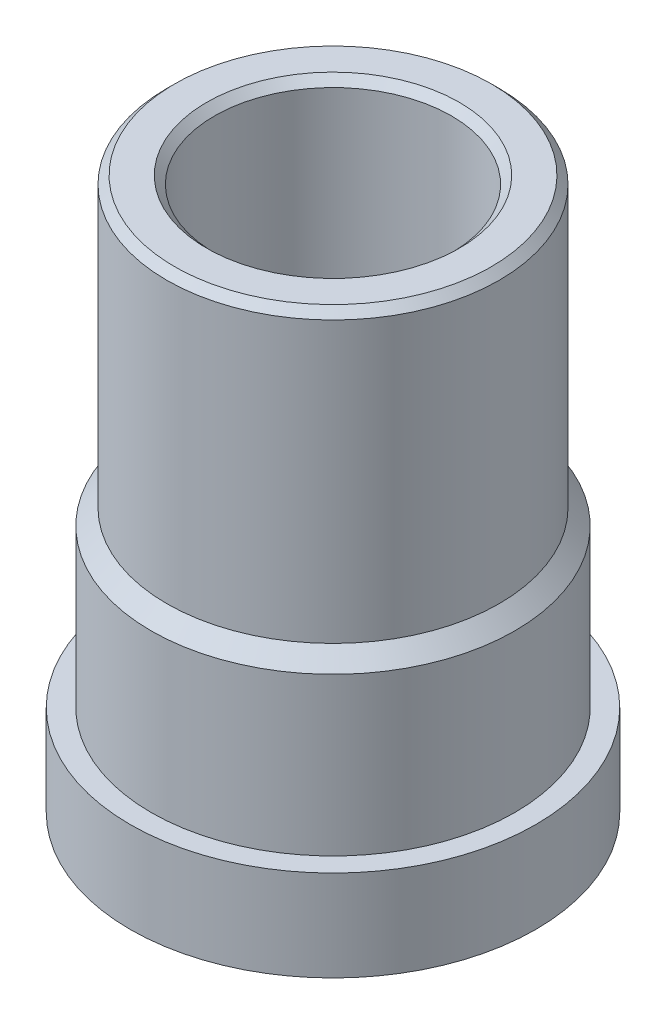
ISO-10303-21;
HEADER;
FILE_DESCRIPTION(('STEP AP214'),'2;1');
FILE_NAME('part.step','',(''),(''),'','','');
FILE_SCHEMA(('AUTOMOTIVE_DESIGN { 1 0 10303 214 1 1 1 1 }'));
ENDSEC;
DATA;
#1=APPLICATION_CONTEXT('core data for automotive mechanical design processes');
#2=APPLICATION_PROTOCOL_DEFINITION('international standard','automotive_design',2000,#1);
#3=PRODUCT_CONTEXT('',#1,'mechanical');
#4=PRODUCT('Part','Part','',(#3));
#5=PRODUCT_RELATED_PRODUCT_CATEGORY('part','',(#4));
#6=PRODUCT_DEFINITION_FORMATION('','',#4);
#7=PRODUCT_DEFINITION_CONTEXT('part definition',#1,'design');
#8=PRODUCT_DEFINITION('design','',#6,#7);
#9=PRODUCT_DEFINITION_SHAPE('','',#8);
#10=(LENGTH_UNIT() NAMED_UNIT(*) SI_UNIT(.MILLI.,.METRE.));
#11=(NAMED_UNIT(*) PLANE_ANGLE_UNIT() SI_UNIT($,.RADIAN.));
#12=(NAMED_UNIT(*) SI_UNIT($,.STERADIAN.) SOLID_ANGLE_UNIT());
#13=UNCERTAINTY_MEASURE_WITH_UNIT(LENGTH_MEASURE(1.E-05),#10,'distance_accuracy_value','');
#14=(GEOMETRIC_REPRESENTATION_CONTEXT(3) GLOBAL_UNCERTAINTY_ASSIGNED_CONTEXT((#13)) GLOBAL_UNIT_ASSIGNED_CONTEXT((#10,
#11,#12)) REPRESENTATION_CONTEXT('',''));
#15=CARTESIAN_POINT('',(0.,0.,0.));
#16=DIRECTION('',(0.,0.,1.));
#17=DIRECTION('',(1.,0.,0.));
#18=AXIS2_PLACEMENT_3D('',#15,#16,#17);
#19=CARTESIAN_POINT('',(0.,0.,0.));
#20=DIRECTION('',(0.,-1.,0.));
#21=DIRECTION('',(0.,0.,-1.));
#22=AXIS2_PLACEMENT_3D('',#19,#20,#21);
#23=PLANE('',#22);
#24=CARTESIAN_POINT('',(0.,0.,0.));
#25=DIRECTION('',(0.,-1.,0.));
#26=DIRECTION('',(0.,0.,-1.));
#27=AXIS2_PLACEMENT_3D('',#24,#25,#26);
#28=CIRCLE('',#27,0.915);
#29=CARTESIAN_POINT('',(0.,0.,-0.915));
#30=VERTEX_POINT('',#29);
#31=EDGE_CURVE('E10',#30,#30,#28,.T.);
#32=ORIENTED_EDGE('',*,*,#31,.T.);
#33=EDGE_LOOP('',(#32));
#34=FACE_BOUND('',#33,.T.);
#35=ADVANCED_FACE('F32',(#34),#23,.T.);
#36=CARTESIAN_POINT('',(0.,0.,0.));
#37=DIRECTION('',(0.,-1.,0.));
#38=DIRECTION('',(0.,0.,-1.));
#39=AXIS2_PLACEMENT_3D('',#36,#37,#38);
#40=CYLINDRICAL_SURFACE('',#39,0.915);
#41=CARTESIAN_POINT('',(0.,0.41,0.));
#42=DIRECTION('',(0.,-1.,0.));
#43=DIRECTION('',(0.,0.,-1.));
#44=AXIS2_PLACEMENT_3D('',#41,#42,#43);
#45=CIRCLE('',#44,0.915);
#46=CARTESIAN_POINT('',(0.,0.41,-0.915));
#47=VERTEX_POINT('',#46);
#48=EDGE_CURVE('E38',#47,#47,#45,.T.);
#49=ORIENTED_EDGE('',*,*,#48,.T.);
#50=EDGE_LOOP('',(#49));
#51=FACE_BOUND('',#50,.T.);
#52=ORIENTED_EDGE('',*,*,#31,.F.);
#53=EDGE_LOOP('',(#52));
#54=FACE_BOUND('',#53,.T.);
#55=ADVANCED_FACE('F82',(#51,#54),#40,.T.);
#56=CARTESIAN_POINT('',(0.915,0.41,0.));
#57=DIRECTION('',(0.,1.,0.));
#58=DIRECTION('',(0.,0.,1.));
#59=AXIS2_PLACEMENT_3D('',#56,#57,#58);
#60=PLANE('',#59);
#61=CARTESIAN_POINT('',(0.,0.41,0.));
#62=DIRECTION('',(0.,-1.,0.));
#63=DIRECTION('',(0.,0.,-1.));
#64=AXIS2_PLACEMENT_3D('',#61,#62,#63);
#65=CIRCLE('',#64,0.820710678118655);
#66=CARTESIAN_POINT('',(0.,0.41,-0.820710678118655));
#67=VERTEX_POINT('',#66);
#68=EDGE_CURVE('E42',#67,#67,#65,.T.);
#69=ORIENTED_EDGE('',*,*,#68,.T.);
#70=EDGE_LOOP('',(#69));
#71=FACE_BOUND('',#70,.T.);
#72=ORIENTED_EDGE('',*,*,#48,.F.);
#73=EDGE_LOOP('',(#72));
#74=FACE_BOUND('',#73,.T.);
#75=ADVANCED_FACE('F86',(#71,#74),#60,.T.);
#76=CARTESIAN_POINT('',(0.,0.,0.));
#77=DIRECTION('',(0.,-1.,0.));
#78=DIRECTION('',(0.,0.,-1.));
#79=AXIS2_PLACEMENT_3D('',#76,#77,#78);
#80=CYLINDRICAL_SURFACE('',#79,0.820710678118655);
#81=CARTESIAN_POINT('',(0.,1.12,0.));
#82=DIRECTION('',(0.,-1.,0.));
#83=DIRECTION('',(0.,0.,-1.));
#84=AXIS2_PLACEMENT_3D('',#81,#82,#83);
#85=CIRCLE('',#84,0.820710678118655);
#86=CARTESIAN_POINT('',(0.,1.12,-0.820710678118655));
#87=VERTEX_POINT('',#86);
#88=EDGE_CURVE('E46',#87,#87,#85,.T.);
#89=ORIENTED_EDGE('',*,*,#88,.T.);
#90=EDGE_LOOP('',(#89));
#91=FACE_BOUND('',#90,.T.);
#92=ORIENTED_EDGE('',*,*,#68,.F.);
#93=EDGE_LOOP('',(#92));
#94=FACE_BOUND('',#93,.T.);
#95=ADVANCED_FACE('F90',(#91,#94),#80,.T.);
#96=CARTESIAN_POINT('',(0.,1.12,0.));
#97=DIRECTION('',(0.,-1.,0.));
#98=DIRECTION('',(0.,0.,-1.));
#99=AXIS2_PLACEMENT_3D('',#96,#97,#98);
#100=CONICAL_SURFACE('',#99,0.820710678118655,0.785398163397429);
#101=CARTESIAN_POINT('',(0.,1.19071067811866,0.));
#102=DIRECTION('',(0.,-1.,0.));
#103=DIRECTION('',(0.,0.,-1.));
#104=AXIS2_PLACEMENT_3D('',#101,#102,#103);
#105=CIRCLE('',#104,0.749999999999999);
#106=CARTESIAN_POINT('',(0.,1.19071067811866,-0.749999999999999));
#107=VERTEX_POINT('',#106);
#108=EDGE_CURVE('E51',#107,#107,#105,.T.);
#109=ORIENTED_EDGE('',*,*,#108,.T.);
#110=EDGE_LOOP('',(#109));
#111=FACE_BOUND('',#110,.T.);
#112=ORIENTED_EDGE('',*,*,#88,.F.);
#113=EDGE_LOOP('',(#112));
#114=FACE_BOUND('',#113,.T.);
#115=ADVANCED_FACE('F97',(#111,#114),#100,.T.);
#116=CARTESIAN_POINT('',(0.,0.,0.));
#117=DIRECTION('',(0.,-1.,0.));
#118=DIRECTION('',(0.,0.,-1.));
#119=AXIS2_PLACEMENT_3D('',#116,#117,#118);
#120=CYLINDRICAL_SURFACE('',#119,0.749999999999999);
#121=CARTESIAN_POINT('',(0.,2.45464466094067,0.));
#122=DIRECTION('',(0.,-1.,0.));
#123=DIRECTION('',(0.,0.,-1.));
#124=AXIS2_PLACEMENT_3D('',#121,#122,#123);
#125=CIRCLE('',#124,0.75);
#126=CARTESIAN_POINT('',(0.,2.45464466094067,-0.75));
#127=VERTEX_POINT('',#126);
#128=EDGE_CURVE('E54',#127,#127,#125,.T.);
#129=ORIENTED_EDGE('',*,*,#128,.T.);
#130=EDGE_LOOP('',(#129));
#131=FACE_BOUND('',#130,.T.);
#132=ORIENTED_EDGE('',*,*,#108,.F.);
#133=EDGE_LOOP('',(#132));
#134=FACE_BOUND('',#133,.T.);
#135=ADVANCED_FACE('F101',(#131,#134),#120,.T.);
#136=CARTESIAN_POINT('',(0.,2.45464466094067,0.));
#137=DIRECTION('',(0.,-1.,0.));
#138=DIRECTION('',(0.,0.,-1.));
#139=AXIS2_PLACEMENT_3D('',#136,#137,#138);
#140=CONICAL_SURFACE('',#139,0.75,0.785398163397451);
#141=CARTESIAN_POINT('',(0.,2.49,0.));
#142=DIRECTION('',(0.,-1.,0.));
#143=DIRECTION('',(0.,0.,-1.));
#144=AXIS2_PLACEMENT_3D('',#141,#142,#143);
#145=CIRCLE('',#144,0.714644660940672);
#146=CARTESIAN_POINT('',(0.,2.49,-0.714644660940672));
#147=VERTEX_POINT('',#146);
#148=EDGE_CURVE('E57',#147,#147,#145,.T.);
#149=ORIENTED_EDGE('',*,*,#148,.T.);
#150=EDGE_LOOP('',(#149));
#151=FACE_BOUND('',#150,.T.);
#152=ORIENTED_EDGE('',*,*,#128,.F.);
#153=EDGE_LOOP('',(#152));
#154=FACE_BOUND('',#153,.T.);
#155=ADVANCED_FACE('F105',(#151,#154),#140,.T.);
#156=CARTESIAN_POINT('',(0.714644660940672,2.49,0.));
#157=DIRECTION('',(0.,1.,0.));
#158=DIRECTION('',(0.,0.,1.));
#159=AXIS2_PLACEMENT_3D('',#156,#157,#158);
#160=PLANE('',#159);
#161=CARTESIAN_POINT('',(0.,2.49,0.));
#162=DIRECTION('',(0.,-1.,0.));
#163=DIRECTION('',(0.,0.,-1.));
#164=AXIS2_PLACEMENT_3D('',#161,#162,#163);
#165=CIRCLE('',#164,0.570355339059327);
#166=CARTESIAN_POINT('',(0.,2.49,-0.570355339059327));
#167=VERTEX_POINT('',#166);
#168=EDGE_CURVE('E60',#167,#167,#165,.T.);
#169=ORIENTED_EDGE('',*,*,#168,.T.);
#170=EDGE_LOOP('',(#169));
#171=FACE_BOUND('',#170,.T.);
#172=ORIENTED_EDGE('',*,*,#148,.F.);
#173=EDGE_LOOP('',(#172));
#174=FACE_BOUND('',#173,.T.);
#175=ADVANCED_FACE('F109',(#171,#174),#160,.T.);
#176=CARTESIAN_POINT('',(0.,2.49,0.));
#177=DIRECTION('',(0.,1.,0.));
#178=DIRECTION('',(0.,0.,1.));
#179=AXIS2_PLACEMENT_3D('',#176,#177,#178);
#180=CONICAL_SURFACE('',#179,0.570355339059327,0.78539816339745);
#181=CARTESIAN_POINT('',(0.,2.45464466094067,0.));
#182=DIRECTION('',(0.,-1.,0.));
#183=DIRECTION('',(0.,0.,-1.));
#184=AXIS2_PLACEMENT_3D('',#181,#182,#183);
#185=CIRCLE('',#184,0.534999999999999);
#186=CARTESIAN_POINT('',(0.,2.45464466094067,-0.534999999999999));
#187=VERTEX_POINT('',#186);
#188=EDGE_CURVE('E63',#187,#187,#185,.T.);
#189=ORIENTED_EDGE('',*,*,#188,.T.);
#190=EDGE_LOOP('',(#189));
#191=FACE_BOUND('',#190,.T.);
#192=ORIENTED_EDGE('',*,*,#168,.F.);
#193=EDGE_LOOP('',(#192));
#194=FACE_BOUND('',#193,.T.);
#195=ADVANCED_FACE('F79',(#191,#194),#180,.F.);
#196=CARTESIAN_POINT('',(0.,0.,0.));
#197=DIRECTION('',(0.,-1.,0.));
#198=DIRECTION('',(0.,0.,-1.));
#199=AXIS2_PLACEMENT_3D('',#196,#197,#198);
#200=CYLINDRICAL_SURFACE('',#199,0.534999999999999);
#201=CARTESIAN_POINT('',(0.,1.49578162318728,0.));
#202=DIRECTION('',(0.,-1.,0.));
#203=DIRECTION('',(0.,0.,-1.));
#204=AXIS2_PLACEMENT_3D('',#201,#202,#203);
#205=CIRCLE('',#204,0.534999999999999);
#206=CARTESIAN_POINT('',(0.,1.49578162318728,-0.534999999999999));
#207=VERTEX_POINT('',#206);
#208=EDGE_CURVE('E66',#207,#207,#205,.T.);
#209=ORIENTED_EDGE('',*,*,#208,.T.);
#210=EDGE_LOOP('',(#209));
#211=FACE_BOUND('',#210,.T.);
#212=ORIENTED_EDGE('',*,*,#188,.F.);
#213=EDGE_LOOP('',(#212));
#214=FACE_BOUND('',#213,.T.);
#215=ADVANCED_FACE('F70',(#211,#214),#200,.F.);
#216=CARTESIAN_POINT('',(0.534999999999999,1.49578162318728,0.));
#217=DIRECTION('',(0.,1.,0.));
#218=DIRECTION('',(0.,0.,1.));
#219=AXIS2_PLACEMENT_3D('',#216,#217,#218);
#220=PLANE('',#219);
#221=ORIENTED_EDGE('',*,*,#208,.F.);
#222=EDGE_LOOP('',(#221));
#223=FACE_BOUND('',#222,.T.);
#224=ADVANCED_FACE('F73',(#223),#220,.T.);
#225=CLOSED_SHELL('',(#35,#55,#75,#95,#115,#135,#155,#175,#195,#215,#224));
#226=MANIFOLD_SOLID_BREP('B2',#225);
#227=ADVANCED_BREP_SHAPE_REPRESENTATION('',(#18,#226),#14);
#228=SHAPE_DEFINITION_REPRESENTATION(#9,#227);
ENDSEC;
END-ISO-10303-21;
